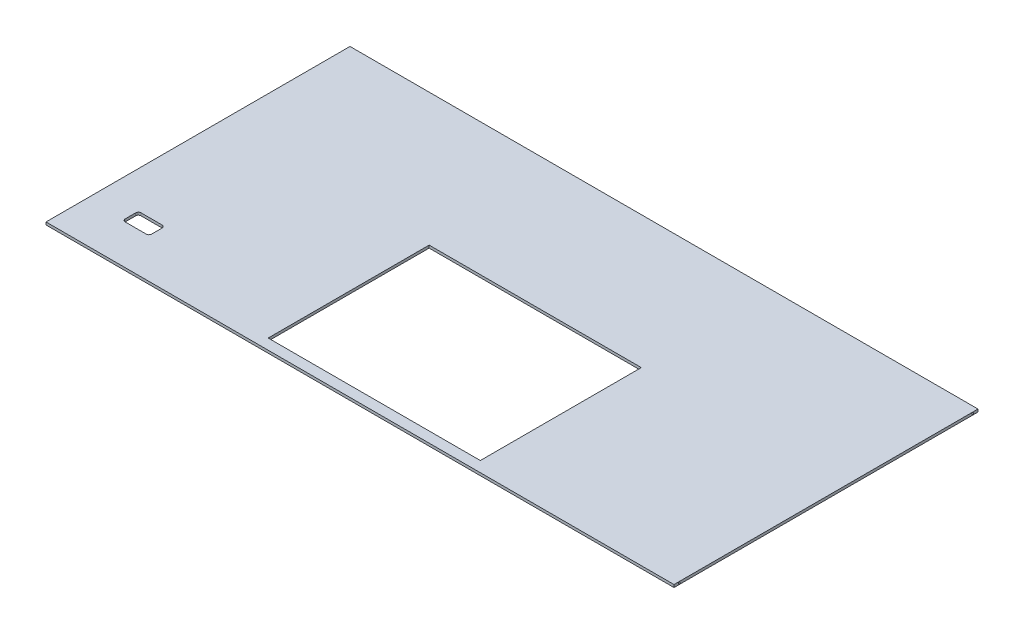
ISO-10303-21;
HEADER;
FILE_DESCRIPTION(('STEP AP214'),'2;1');
FILE_NAME('part.step','',(''),(''),'','','');
FILE_SCHEMA(('AUTOMOTIVE_DESIGN { 1 0 10303 214 1 1 1 1 }'));
ENDSEC;
DATA;
#1=APPLICATION_CONTEXT('core data for automotive mechanical design processes');
#2=APPLICATION_PROTOCOL_DEFINITION('international standard','automotive_design',2000,#1);
#3=PRODUCT_CONTEXT('',#1,'mechanical');
#4=PRODUCT('Part','Part','',(#3));
#5=PRODUCT_RELATED_PRODUCT_CATEGORY('part','',(#4));
#6=PRODUCT_DEFINITION_FORMATION('','',#4);
#7=PRODUCT_DEFINITION_CONTEXT('part definition',#1,'design');
#8=PRODUCT_DEFINITION('design','',#6,#7);
#9=PRODUCT_DEFINITION_SHAPE('','',#8);
#10=(LENGTH_UNIT() NAMED_UNIT(*) SI_UNIT(.MILLI.,.METRE.));
#11=(NAMED_UNIT(*) PLANE_ANGLE_UNIT() SI_UNIT($,.RADIAN.));
#12=(NAMED_UNIT(*) SI_UNIT($,.STERADIAN.) SOLID_ANGLE_UNIT());
#13=UNCERTAINTY_MEASURE_WITH_UNIT(LENGTH_MEASURE(1.E-05),#10,'distance_accuracy_value','');
#14=(GEOMETRIC_REPRESENTATION_CONTEXT(3) GLOBAL_UNCERTAINTY_ASSIGNED_CONTEXT((#13)) GLOBAL_UNIT_ASSIGNED_CONTEXT((#10,
#11,#12)) REPRESENTATION_CONTEXT('',''));
#15=CARTESIAN_POINT('',(0.,0.,0.));
#16=DIRECTION('',(0.,0.,1.));
#17=DIRECTION('',(1.,0.,0.));
#18=AXIS2_PLACEMENT_3D('',#15,#16,#17);
#19=CARTESIAN_POINT('',(-595.,4.99999999999989,288.));
#20=DIRECTION('',(1.,0.,0.));
#21=DIRECTION('',(0.,0.,-1.));
#22=AXIS2_PLACEMENT_3D('',#19,#20,#21);
#23=PLANE('',#22);
#24=CARTESIAN_POINT('',(-595.,2.49999999999995,278.));
#25=DIRECTION('',(1.,0.,0.));
#26=DIRECTION('',(0.,0.,-1.));
#27=AXIS2_PLACEMENT_3D('',#24,#25,#26);
#28=CIRCLE('',#27,1.50000000000002);
#29=CARTESIAN_POINT('',(-595.,2.49999999999995,276.5));
#30=VERTEX_POINT('',#29);
#31=EDGE_CURVE('E233',#30,#30,#28,.T.);
#32=ORIENTED_EDGE('',*,*,#31,.T.);
#33=EDGE_LOOP('',(#32));
#34=FACE_BOUND('',#33,.T.);
#35=CARTESIAN_POINT('',(-595.,2.49999999999995,-278.));
#36=DIRECTION('',(1.,0.,0.));
#37=DIRECTION('',(0.,0.,1.));
#38=AXIS2_PLACEMENT_3D('',#35,#36,#37);
#39=CIRCLE('',#38,1.49999999999633);
#40=CARTESIAN_POINT('',(-595.,2.49999999999995,-276.500000000003));
#41=VERTEX_POINT('',#40);
#42=EDGE_CURVE('E222',#41,#41,#39,.T.);
#43=ORIENTED_EDGE('',*,*,#42,.T.);
#44=EDGE_LOOP('',(#43));
#45=FACE_BOUND('',#44,.T.);
#46=DIRECTION('',(0.,0.,1.));
#47=VECTOR('',#46,1.);
#48=CARTESIAN_POINT('',(-595.,0.,288.));
#49=LINE('',#48,#47);
#50=CARTESIAN_POINT('',(-595.,0.,-288.));
#51=VERTEX_POINT('',#50);
#52=CARTESIAN_POINT('',(-595.,0.,288.));
#53=VERTEX_POINT('',#52);
#54=EDGE_CURVE('E244',#51,#53,#49,.T.);
#55=ORIENTED_EDGE('',*,*,#54,.T.);
#56=DIRECTION('',(0.,-1.,0.));
#57=VECTOR('',#56,1.);
#58=CARTESIAN_POINT('',(-595.,4.99999999999989,288.));
#59=LINE('',#58,#57);
#60=CARTESIAN_POINT('',(-595.,4.99999999999989,288.));
#61=VERTEX_POINT('',#60);
#62=EDGE_CURVE('E279',#61,#53,#59,.T.);
#63=ORIENTED_EDGE('',*,*,#62,.F.);
#64=DIRECTION('',(0.,0.,1.));
#65=VECTOR('',#64,1.);
#66=CARTESIAN_POINT('',(-595.,4.99999999999989,288.));
#67=LINE('',#66,#65);
#68=CARTESIAN_POINT('',(-595.,4.99999999999989,-288.));
#69=VERTEX_POINT('',#68);
#70=EDGE_CURVE('E253',#69,#61,#67,.T.);
#71=ORIENTED_EDGE('',*,*,#70,.F.);
#72=DIRECTION('',(0.,-1.,0.));
#73=VECTOR('',#72,1.);
#74=CARTESIAN_POINT('',(-595.,4.99999999999989,-288.));
#75=LINE('',#74,#73);
#76=EDGE_CURVE('E263',#69,#51,#75,.T.);
#77=ORIENTED_EDGE('',*,*,#76,.T.);
#78=EDGE_LOOP('',(#55,#63,#71,#77));
#79=FACE_BOUND('',#78,.T.);
#80=ADVANCED_FACE('F47',(#34,#45,#79),#23,.F.);
#81=CARTESIAN_POINT('',(595.,4.99999999999989,288.));
#82=DIRECTION('',(0.,0.,-1.));
#83=DIRECTION('',(-1.,0.,0.));
#84=AXIS2_PLACEMENT_3D('',#81,#82,#83);
#85=PLANE('',#84);
#86=DIRECTION('',(1.,0.,0.));
#87=VECTOR('',#86,1.);
#88=CARTESIAN_POINT('',(595.,0.,288.));
#89=LINE('',#88,#87);
#90=CARTESIAN_POINT('',(595.,0.,288.));
#91=VERTEX_POINT('',#90);
#92=EDGE_CURVE('E266',#53,#91,#89,.T.);
#93=ORIENTED_EDGE('',*,*,#92,.T.);
#94=DIRECTION('',(0.,-1.,0.));
#95=VECTOR('',#94,1.);
#96=CARTESIAN_POINT('',(595.,4.99999999999989,288.));
#97=LINE('',#96,#95);
#98=CARTESIAN_POINT('',(595.,4.99999999999989,288.));
#99=VERTEX_POINT('',#98);
#100=EDGE_CURVE('E276',#99,#91,#97,.T.);
#101=ORIENTED_EDGE('',*,*,#100,.F.);
#102=DIRECTION('',(1.,0.,0.));
#103=VECTOR('',#102,1.);
#104=CARTESIAN_POINT('',(595.,4.99999999999989,288.));
#105=LINE('',#104,#103);
#106=EDGE_CURVE('E256',#61,#99,#105,.T.);
#107=ORIENTED_EDGE('',*,*,#106,.F.);
#108=ORIENTED_EDGE('',*,*,#62,.T.);
#109=EDGE_LOOP('',(#93,#101,#107,#108));
#110=FACE_BOUND('',#109,.T.);
#111=ADVANCED_FACE('F346',(#110),#85,.F.);
#112=CARTESIAN_POINT('',(595.,4.99999999999989,288.));
#113=DIRECTION('',(-1.,0.,0.));
#114=DIRECTION('',(0.,0.,1.));
#115=AXIS2_PLACEMENT_3D('',#112,#113,#114);
#116=PLANE('',#115);
#117=CARTESIAN_POINT('',(595.,2.49999999999995,278.));
#118=DIRECTION('',(1.,0.,0.));
#119=DIRECTION('',(0.,0.,-1.));
#120=AXIS2_PLACEMENT_3D('',#117,#118,#119);
#121=CIRCLE('',#120,1.50000000000002);
#122=CARTESIAN_POINT('',(595.,2.49999999999995,276.5));
#123=VERTEX_POINT('',#122);
#124=EDGE_CURVE('E245',#123,#123,#121,.T.);
#125=ORIENTED_EDGE('',*,*,#124,.F.);
#126=EDGE_LOOP('',(#125));
#127=FACE_BOUND('',#126,.T.);
#128=CARTESIAN_POINT('',(595.,2.49999999999995,-278.));
#129=DIRECTION('',(1.,0.,0.));
#130=DIRECTION('',(0.,0.,1.));
#131=AXIS2_PLACEMENT_3D('',#128,#129,#130);
#132=CIRCLE('',#131,1.49999999999633);
#133=CARTESIAN_POINT('',(595.,2.49999999999995,-276.500000000003));
#134=VERTEX_POINT('',#133);
#135=EDGE_CURVE('E248',#134,#134,#132,.T.);
#136=ORIENTED_EDGE('',*,*,#135,.F.);
#137=EDGE_LOOP('',(#136));
#138=FACE_BOUND('',#137,.T.);
#139=DIRECTION('',(0.,0.,-1.));
#140=VECTOR('',#139,1.);
#141=CARTESIAN_POINT('',(595.,0.,288.));
#142=LINE('',#141,#140);
#143=CARTESIAN_POINT('',(595.,0.,-288.));
#144=VERTEX_POINT('',#143);
#145=EDGE_CURVE('E268',#91,#144,#142,.T.);
#146=ORIENTED_EDGE('',*,*,#145,.T.);
#147=DIRECTION('',(0.,-1.,0.));
#148=VECTOR('',#147,1.);
#149=CARTESIAN_POINT('',(595.,4.99999999999989,-288.));
#150=LINE('',#149,#148);
#151=CARTESIAN_POINT('',(595.,4.99999999999989,-288.));
#152=VERTEX_POINT('',#151);
#153=EDGE_CURVE('E273',#152,#144,#150,.T.);
#154=ORIENTED_EDGE('',*,*,#153,.F.);
#155=DIRECTION('',(0.,0.,-1.));
#156=VECTOR('',#155,1.);
#157=CARTESIAN_POINT('',(595.,4.99999999999989,288.));
#158=LINE('',#157,#156);
#159=EDGE_CURVE('E259',#99,#152,#158,.T.);
#160=ORIENTED_EDGE('',*,*,#159,.F.);
#161=ORIENTED_EDGE('',*,*,#100,.T.);
#162=EDGE_LOOP('',(#146,#154,#160,#161));
#163=FACE_BOUND('',#162,.T.);
#164=ADVANCED_FACE('F352',(#127,#138,#163),#116,.F.);
#165=CARTESIAN_POINT('',(595.,4.99999999999989,-288.));
#166=DIRECTION('',(0.,0.,1.));
#167=DIRECTION('',(1.,0.,0.));
#168=AXIS2_PLACEMENT_3D('',#165,#166,#167);
#169=PLANE('',#168);
#170=DIRECTION('',(-1.,0.,0.));
#171=VECTOR('',#170,1.);
#172=CARTESIAN_POINT('',(595.,0.,-288.));
#173=LINE('',#172,#171);
#174=EDGE_CURVE('E257',#144,#51,#173,.T.);
#175=ORIENTED_EDGE('',*,*,#174,.T.);
#176=ORIENTED_EDGE('',*,*,#76,.F.);
#177=DIRECTION('',(-1.,0.,0.));
#178=VECTOR('',#177,1.);
#179=CARTESIAN_POINT('',(595.,4.99999999999989,-288.));
#180=LINE('',#179,#178);
#181=EDGE_CURVE('E261',#152,#69,#180,.T.);
#182=ORIENTED_EDGE('',*,*,#181,.F.);
#183=ORIENTED_EDGE('',*,*,#153,.T.);
#184=EDGE_LOOP('',(#175,#176,#182,#183));
#185=FACE_BOUND('',#184,.T.);
#186=ADVANCED_FACE('F371',(#185),#169,.F.);
#187=CARTESIAN_POINT('',(0.,4.99999999999989,0.));
#188=DIRECTION('',(0.,1.,0.));
#189=DIRECTION('',(0.,0.,1.));
#190=AXIS2_PLACEMENT_3D('',#187,#188,#189);
#191=PLANE('',#190);
#192=CARTESIAN_POINT('',(-520.000000000028,4.99999999999989,187.99999999998));
#193=DIRECTION('',(0.,1.,0.));
#194=DIRECTION('',(0.,0.,-1.));
#195=AXIS2_PLACEMENT_3D('',#192,#193,#194);
#196=CIRCLE('',#195,4.99999999999921);
#197=CARTESIAN_POINT('',(-520.000000000028,4.99999999999989,182.999999999981));
#198=VERTEX_POINT('',#197);
#199=CARTESIAN_POINT('',(-525.000000000027,4.99999999999989,187.99999999998));
#200=VERTEX_POINT('',#199);
#201=EDGE_CURVE('E61',#198,#200,#196,.T.);
#202=ORIENTED_EDGE('',*,*,#201,.F.);
#203=DIRECTION('',(-1.,0.,0.));
#204=VECTOR('',#203,1.);
#205=CARTESIAN_POINT('',(-520.000000000028,4.99999999999989,182.999999999981));
#206=LINE('',#205,#204);
#207=CARTESIAN_POINT('',(-480.000000000026,4.99999999999989,182.999999999981));
#208=VERTEX_POINT('',#207);
#209=EDGE_CURVE('E193',#208,#198,#206,.T.);
#210=ORIENTED_EDGE('',*,*,#209,.F.);
#211=CARTESIAN_POINT('',(-480.000000000026,4.99999999999989,187.99999999998));
#212=DIRECTION('',(0.,1.,0.));
#213=DIRECTION('',(0.,0.,-1.));
#214=AXIS2_PLACEMENT_3D('',#211,#212,#213);
#215=CIRCLE('',#214,4.99999999999917);
#216=CARTESIAN_POINT('',(-475.000000000027,4.99999999999989,187.999999999981));
#217=VERTEX_POINT('',#216);
#218=EDGE_CURVE('E190',#217,#208,#215,.T.);
#219=ORIENTED_EDGE('',*,*,#218,.F.);
#220=DIRECTION('',(0.,0.,-1.));
#221=VECTOR('',#220,1.);
#222=CARTESIAN_POINT('',(-475.000000000027,4.99999999999989,187.999999999981));
#223=LINE('',#222,#221);
#224=CARTESIAN_POINT('',(-475.000000000027,4.99999999999989,207.999999999981));
#225=VERTEX_POINT('',#224);
#226=EDGE_CURVE('E187',#225,#217,#223,.T.);
#227=ORIENTED_EDGE('',*,*,#226,.F.);
#228=CARTESIAN_POINT('',(-480.000000000027,4.99999999999989,207.999999999981));
#229=DIRECTION('',(0.,1.,0.));
#230=DIRECTION('',(0.,0.,-1.));
#231=AXIS2_PLACEMENT_3D('',#228,#229,#230);
#232=CIRCLE('',#231,5.);
#233=CARTESIAN_POINT('',(-480.000000000027,4.99999999999989,212.999999999981));
#234=VERTEX_POINT('',#233);
#235=EDGE_CURVE('E181',#234,#225,#232,.T.);
#236=ORIENTED_EDGE('',*,*,#235,.F.);
#237=DIRECTION('',(1.,0.,0.));
#238=VECTOR('',#237,1.);
#239=CARTESIAN_POINT('',(-480.000000000027,4.99999999999989,212.999999999981));
#240=LINE('',#239,#238);
#241=CARTESIAN_POINT('',(-520.000000000027,4.99999999999989,212.999999999981));
#242=VERTEX_POINT('',#241);
#243=EDGE_CURVE('E179',#242,#234,#240,.T.);
#244=ORIENTED_EDGE('',*,*,#243,.F.);
#245=CARTESIAN_POINT('',(-520.000000000027,4.99999999999989,207.999999999981));
#246=DIRECTION('',(0.,1.,0.));
#247=DIRECTION('',(0.,0.,-1.));
#248=AXIS2_PLACEMENT_3D('',#245,#246,#247);
#249=CIRCLE('',#248,4.99999999999992);
#250=CARTESIAN_POINT('',(-525.000000000027,4.99999999999989,207.999999999981));
#251=VERTEX_POINT('',#250);
#252=EDGE_CURVE('E162',#251,#242,#249,.T.);
#253=ORIENTED_EDGE('',*,*,#252,.F.);
#254=DIRECTION('',(0.,0.,1.));
#255=VECTOR('',#254,1.);
#256=CARTESIAN_POINT('',(-525.000000000027,4.99999999999989,207.999999999981));
#257=LINE('',#256,#255);
#258=EDGE_CURVE('E171',#200,#251,#257,.T.);
#259=ORIENTED_EDGE('',*,*,#258,.F.);
#260=EDGE_LOOP('',(#202,#210,#219,#227,#236,#244,#253,#259));
#261=FACE_BOUND('',#260,.T.);
#262=DIRECTION('',(0.,0.,1.));
#263=VECTOR('',#262,1.);
#264=CARTESIAN_POINT('',(-194.,4.99999999999989,-36.9999999999999));
#265=LINE('',#264,#263);
#266=CARTESIAN_POINT('',(-194.,4.99999999999989,-36.9999999999999));
#267=VERTEX_POINT('',#266);
#268=CARTESIAN_POINT('',(-194.,4.99999999999989,268.));
#269=VERTEX_POINT('',#268);
#270=EDGE_CURVE('E198',#267,#269,#265,.T.);
#271=ORIENTED_EDGE('',*,*,#270,.F.);
#272=DIRECTION('',(-1.,0.,0.));
#273=VECTOR('',#272,1.);
#274=CARTESIAN_POINT('',(-194.,4.99999999999989,-36.9999999999999));
#275=LINE('',#274,#273);
#276=CARTESIAN_POINT('',(208.,4.99999999999989,-36.9999999999999));
#277=VERTEX_POINT('',#276);
#278=EDGE_CURVE('E216',#277,#267,#275,.T.);
#279=ORIENTED_EDGE('',*,*,#278,.F.);
#280=DIRECTION('',(0.,0.,-1.));
#281=VECTOR('',#280,1.);
#282=CARTESIAN_POINT('',(208.,4.99999999999989,-36.9999999999999));
#283=LINE('',#282,#281);
#284=CARTESIAN_POINT('',(208.,4.99999999999989,268.));
#285=VERTEX_POINT('',#284);
#286=EDGE_CURVE('E213',#285,#277,#283,.T.);
#287=ORIENTED_EDGE('',*,*,#286,.F.);
#288=DIRECTION('',(1.,0.,0.));
#289=VECTOR('',#288,1.);
#290=CARTESIAN_POINT('',(-194.,4.99999999999989,268.));
#291=LINE('',#290,#289);
#292=EDGE_CURVE('E210',#269,#285,#291,.T.);
#293=ORIENTED_EDGE('',*,*,#292,.F.);
#294=EDGE_LOOP('',(#271,#279,#287,#293));
#295=FACE_BOUND('',#294,.T.);
#296=ORIENTED_EDGE('',*,*,#70,.T.);
#297=ORIENTED_EDGE('',*,*,#106,.T.);
#298=ORIENTED_EDGE('',*,*,#159,.T.);
#299=ORIENTED_EDGE('',*,*,#181,.T.);
#300=EDGE_LOOP('',(#296,#297,#298,#299));
#301=FACE_BOUND('',#300,.T.);
#302=ADVANCED_FACE('F175',(#261,#295,#301),#191,.T.);
#303=CARTESIAN_POINT('',(0.,0.,0.));
#304=DIRECTION('',(0.,1.,0.));
#305=DIRECTION('',(0.,0.,1.));
#306=AXIS2_PLACEMENT_3D('',#303,#304,#305);
#307=PLANE('',#306);
#308=DIRECTION('',(-1.,0.,0.));
#309=VECTOR('',#308,1.);
#310=CARTESIAN_POINT('',(-2.03309591384482E-12,0.,182.999999999987));
#311=LINE('',#310,#309);
#312=CARTESIAN_POINT('',(-480.000000000026,0.,182.999999999981));
#313=VERTEX_POINT('',#312);
#314=CARTESIAN_POINT('',(-520.000000000028,0.,182.999999999981));
#315=VERTEX_POINT('',#314);
#316=EDGE_CURVE('E54',#313,#315,#311,.T.);
#317=ORIENTED_EDGE('',*,*,#316,.T.);
#318=CARTESIAN_POINT('',(-520.000000000028,0.,187.99999999998));
#319=DIRECTION('',(0.,1.,0.));
#320=DIRECTION('',(0.,0.,1.));
#321=AXIS2_PLACEMENT_3D('',#318,#319,#320);
#322=CIRCLE('',#321,4.99999999999921);
#323=CARTESIAN_POINT('',(-525.000000000027,0.,187.99999999998));
#324=VERTEX_POINT('',#323);
#325=EDGE_CURVE('E11',#315,#324,#322,.T.);
#326=ORIENTED_EDGE('',*,*,#325,.T.);
#327=DIRECTION('',(0.,0.,1.));
#328=VECTOR('',#327,1.);
#329=CARTESIAN_POINT('',(-525.000000000025,0.,-5.77315972805081E-12));
#330=LINE('',#329,#328);
#331=CARTESIAN_POINT('',(-525.000000000027,0.,207.999999999981));
#332=VERTEX_POINT('',#331);
#333=EDGE_CURVE('E294',#324,#332,#330,.T.);
#334=ORIENTED_EDGE('',*,*,#333,.T.);
#335=CARTESIAN_POINT('',(-520.000000000027,0.,207.999999999981));
#336=DIRECTION('',(0.,1.,0.));
#337=DIRECTION('',(0.,0.,1.));
#338=AXIS2_PLACEMENT_3D('',#335,#336,#337);
#339=CIRCLE('',#338,4.99999999999992);
#340=CARTESIAN_POINT('',(-520.000000000027,0.,212.999999999981));
#341=VERTEX_POINT('',#340);
#342=EDGE_CURVE('E165',#332,#341,#339,.T.);
#343=ORIENTED_EDGE('',*,*,#342,.T.);
#344=DIRECTION('',(1.,0.,0.));
#345=VECTOR('',#344,1.);
#346=CARTESIAN_POINT('',(-2.21350715534641E-12,0.,212.999999999986));
#347=LINE('',#346,#345);
#348=CARTESIAN_POINT('',(-480.000000000027,0.,212.999999999981));
#349=VERTEX_POINT('',#348);
#350=EDGE_CURVE('E297',#341,#349,#347,.T.);
#351=ORIENTED_EDGE('',*,*,#350,.T.);
#352=CARTESIAN_POINT('',(-480.000000000027,0.,207.999999999981));
#353=DIRECTION('',(0.,1.,0.));
#354=DIRECTION('',(0.,0.,1.));
#355=AXIS2_PLACEMENT_3D('',#352,#353,#354);
#356=CIRCLE('',#355,5.);
#357=CARTESIAN_POINT('',(-475.000000000027,0.,207.999999999981));
#358=VERTEX_POINT('',#357);
#359=EDGE_CURVE('E300',#349,#358,#356,.T.);
#360=ORIENTED_EDGE('',*,*,#359,.T.);
#361=DIRECTION('',(0.,0.,-1.));
#362=VECTOR('',#361,1.);
#363=CARTESIAN_POINT('',(-475.000000000025,0.,-5.32907051820075E-12));
#364=LINE('',#363,#362);
#365=CARTESIAN_POINT('',(-475.000000000027,0.,187.999999999981));
#366=VERTEX_POINT('',#365);
#367=EDGE_CURVE('E303',#358,#366,#364,.T.);
#368=ORIENTED_EDGE('',*,*,#367,.T.);
#369=CARTESIAN_POINT('',(-480.000000000026,0.,187.99999999998));
#370=DIRECTION('',(0.,1.,0.));
#371=DIRECTION('',(0.,0.,1.));
#372=AXIS2_PLACEMENT_3D('',#369,#370,#371);
#373=CIRCLE('',#372,4.99999999999917);
#374=EDGE_CURVE('E306',#366,#313,#373,.T.);
#375=ORIENTED_EDGE('',*,*,#374,.T.);
#376=EDGE_LOOP('',(#317,#326,#334,#343,#351,#360,#368,#375));
#377=FACE_BOUND('',#376,.T.);
#378=DIRECTION('',(-1.,0.,0.));
#379=VECTOR('',#378,1.);
#380=CARTESIAN_POINT('',(0.,0.,-36.9999999999999));
#381=LINE('',#380,#379);
#382=CARTESIAN_POINT('',(208.,0.,-36.9999999999999));
#383=VERTEX_POINT('',#382);
#384=CARTESIAN_POINT('',(-194.,0.,-36.9999999999999));
#385=VERTEX_POINT('',#384);
#386=EDGE_CURVE('E288',#383,#385,#381,.T.);
#387=ORIENTED_EDGE('',*,*,#386,.T.);
#388=DIRECTION('',(0.,0.,1.));
#389=VECTOR('',#388,1.);
#390=CARTESIAN_POINT('',(-194.,0.,0.));
#391=LINE('',#390,#389);
#392=CARTESIAN_POINT('',(-194.,0.,268.));
#393=VERTEX_POINT('',#392);
#394=EDGE_CURVE('E291',#385,#393,#391,.T.);
#395=ORIENTED_EDGE('',*,*,#394,.T.);
#396=DIRECTION('',(1.,0.,0.));
#397=VECTOR('',#396,1.);
#398=CARTESIAN_POINT('',(0.,0.,268.));
#399=LINE('',#398,#397);
#400=CARTESIAN_POINT('',(208.,0.,268.));
#401=VERTEX_POINT('',#400);
#402=EDGE_CURVE('E282',#393,#401,#399,.T.);
#403=ORIENTED_EDGE('',*,*,#402,.T.);
#404=DIRECTION('',(0.,0.,-1.));
#405=VECTOR('',#404,1.);
#406=CARTESIAN_POINT('',(208.,0.,0.));
#407=LINE('',#406,#405);
#408=EDGE_CURVE('E285',#401,#383,#407,.T.);
#409=ORIENTED_EDGE('',*,*,#408,.T.);
#410=EDGE_LOOP('',(#387,#395,#403,#409));
#411=FACE_BOUND('',#410,.T.);
#412=ORIENTED_EDGE('',*,*,#54,.F.);
#413=ORIENTED_EDGE('',*,*,#174,.F.);
#414=ORIENTED_EDGE('',*,*,#145,.F.);
#415=ORIENTED_EDGE('',*,*,#92,.F.);
#416=EDGE_LOOP('',(#412,#413,#414,#415));
#417=FACE_BOUND('',#416,.T.);
#418=ADVANCED_FACE('F310',(#377,#411,#417),#307,.F.);
#419=CARTESIAN_POINT('',(585.,2.49999999999995,-278.));
#420=DIRECTION('',(1.,0.,0.));
#421=DIRECTION('',(0.,0.,-1.));
#422=AXIS2_PLACEMENT_3D('',#419,#420,#421);
#423=CYLINDRICAL_SURFACE('',#422,1.49999999999633);
#424=CARTESIAN_POINT('',(585.,2.49999999999995,-278.));
#425=DIRECTION('',(1.,0.,0.));
#426=DIRECTION('',(0.,0.,1.));
#427=AXIS2_PLACEMENT_3D('',#424,#425,#426);
#428=CIRCLE('',#427,1.49999999999633);
#429=CARTESIAN_POINT('',(585.,2.49999999999995,-276.500000000003));
#430=VERTEX_POINT('',#429);
#431=EDGE_CURVE('E232',#430,#430,#428,.T.);
#432=ORIENTED_EDGE('',*,*,#431,.F.);
#433=EDGE_LOOP('',(#432));
#434=FACE_BOUND('',#433,.T.);
#435=ORIENTED_EDGE('',*,*,#135,.T.);
#436=EDGE_LOOP('',(#435));
#437=FACE_BOUND('',#436,.T.);
#438=ADVANCED_FACE('F386',(#434,#437),#423,.F.);
#439=CARTESIAN_POINT('',(585.,2.49999999999995,-278.));
#440=DIRECTION('',(-1.,0.,0.));
#441=DIRECTION('',(0.,0.,1.));
#442=AXIS2_PLACEMENT_3D('',#439,#440,#441);
#443=PLANE('',#442);
#444=ORIENTED_EDGE('',*,*,#431,.T.);
#445=EDGE_LOOP('',(#444));
#446=FACE_BOUND('',#445,.T.);
#447=ADVANCED_FACE('F389',(#446),#443,.F.);
#448=CARTESIAN_POINT('',(585.,2.49999999999995,278.));
#449=DIRECTION('',(1.,0.,0.));
#450=DIRECTION('',(0.,0.,-1.));
#451=AXIS2_PLACEMENT_3D('',#448,#449,#450);
#452=CYLINDRICAL_SURFACE('',#451,1.50000000000002);
#453=CARTESIAN_POINT('',(585.,2.49999999999995,278.));
#454=DIRECTION('',(1.,0.,0.));
#455=DIRECTION('',(0.,0.,-1.));
#456=AXIS2_PLACEMENT_3D('',#453,#454,#455);
#457=CIRCLE('',#456,1.50000000000002);
#458=CARTESIAN_POINT('',(585.,2.49999999999995,276.5));
#459=VERTEX_POINT('',#458);
#460=EDGE_CURVE('E241',#459,#459,#457,.T.);
#461=ORIENTED_EDGE('',*,*,#460,.F.);
#462=EDGE_LOOP('',(#461));
#463=FACE_BOUND('',#462,.T.);
#464=ORIENTED_EDGE('',*,*,#124,.T.);
#465=EDGE_LOOP('',(#464));
#466=FACE_BOUND('',#465,.T.);
#467=ADVANCED_FACE('F392',(#463,#466),#452,.F.);
#468=CARTESIAN_POINT('',(585.,2.49999999999995,278.));
#469=DIRECTION('',(1.,0.,0.));
#470=DIRECTION('',(0.,0.,-1.));
#471=AXIS2_PLACEMENT_3D('',#468,#469,#470);
#472=PLANE('',#471);
#473=ORIENTED_EDGE('',*,*,#460,.T.);
#474=EDGE_LOOP('',(#473));
#475=FACE_BOUND('',#474,.T.);
#476=ADVANCED_FACE('F399',(#475),#472,.T.);
#477=CARTESIAN_POINT('',(-585.,2.49999999999995,-278.));
#478=DIRECTION('',(-1.,0.,0.));
#479=DIRECTION('',(0.,0.,1.));
#480=AXIS2_PLACEMENT_3D('',#477,#478,#479);
#481=CYLINDRICAL_SURFACE('',#480,1.49999999999633);
#482=CARTESIAN_POINT('',(-585.,2.49999999999995,-278.));
#483=DIRECTION('',(1.,0.,0.));
#484=DIRECTION('',(0.,0.,1.));
#485=AXIS2_PLACEMENT_3D('',#482,#483,#484);
#486=CIRCLE('',#485,1.49999999999633);
#487=CARTESIAN_POINT('',(-585.,2.49999999999995,-276.500000000003));
#488=VERTEX_POINT('',#487);
#489=EDGE_CURVE('E236',#488,#488,#486,.T.);
#490=ORIENTED_EDGE('',*,*,#489,.T.);
#491=EDGE_LOOP('',(#490));
#492=FACE_BOUND('',#491,.T.);
#493=ORIENTED_EDGE('',*,*,#42,.F.);
#494=EDGE_LOOP('',(#493));
#495=FACE_BOUND('',#494,.T.);
#496=ADVANCED_FACE('F403',(#492,#495),#481,.F.);
#497=CARTESIAN_POINT('',(-585.,2.49999999999995,-278.));
#498=DIRECTION('',(1.,0.,0.));
#499=DIRECTION('',(0.,0.,1.));
#500=AXIS2_PLACEMENT_3D('',#497,#498,#499);
#501=PLANE('',#500);
#502=ORIENTED_EDGE('',*,*,#489,.F.);
#503=EDGE_LOOP('',(#502));
#504=FACE_BOUND('',#503,.T.);
#505=ADVANCED_FACE('F407',(#504),#501,.F.);
#506=CARTESIAN_POINT('',(-585.,2.49999999999995,278.));
#507=DIRECTION('',(-1.,0.,0.));
#508=DIRECTION('',(0.,0.,1.));
#509=AXIS2_PLACEMENT_3D('',#506,#507,#508);
#510=CYLINDRICAL_SURFACE('',#509,1.50000000000002);
#511=CARTESIAN_POINT('',(-585.,2.49999999999995,278.));
#512=DIRECTION('',(1.,0.,0.));
#513=DIRECTION('',(0.,0.,-1.));
#514=AXIS2_PLACEMENT_3D('',#511,#512,#513);
#515=CIRCLE('',#514,1.50000000000002);
#516=CARTESIAN_POINT('',(-585.,2.49999999999995,276.5));
#517=VERTEX_POINT('',#516);
#518=EDGE_CURVE('E229',#517,#517,#515,.T.);
#519=ORIENTED_EDGE('',*,*,#518,.T.);
#520=EDGE_LOOP('',(#519));
#521=FACE_BOUND('',#520,.T.);
#522=ORIENTED_EDGE('',*,*,#31,.F.);
#523=EDGE_LOOP('',(#522));
#524=FACE_BOUND('',#523,.T.);
#525=ADVANCED_FACE('F411',(#521,#524),#510,.F.);
#526=CARTESIAN_POINT('',(-585.,2.49999999999995,278.));
#527=DIRECTION('',(-1.,0.,0.));
#528=DIRECTION('',(0.,0.,-1.));
#529=AXIS2_PLACEMENT_3D('',#526,#527,#528);
#530=PLANE('',#529);
#531=ORIENTED_EDGE('',*,*,#518,.F.);
#532=EDGE_LOOP('',(#531));
#533=FACE_BOUND('',#532,.T.);
#534=ADVANCED_FACE('F415',(#533),#530,.T.);
#535=CARTESIAN_POINT('',(-194.,-0.99999999999989,-36.9999999999999));
#536=DIRECTION('',(-1.,0.,0.));
#537=DIRECTION('',(0.,0.,1.));
#538=AXIS2_PLACEMENT_3D('',#535,#536,#537);
#539=PLANE('',#538);
#540=DIRECTION('',(0.,1.,0.));
#541=VECTOR('',#540,1.);
#542=CARTESIAN_POINT('',(-194.,-0.99999999999989,-36.9999999999999));
#543=LINE('',#542,#541);
#544=EDGE_CURVE('E220',#385,#267,#543,.T.);
#545=ORIENTED_EDGE('',*,*,#544,.T.);
#546=ORIENTED_EDGE('',*,*,#270,.T.);
#547=DIRECTION('',(0.,1.,0.));
#548=VECTOR('',#547,1.);
#549=CARTESIAN_POINT('',(-194.,-0.99999999999989,268.));
#550=LINE('',#549,#548);
#551=EDGE_CURVE('E219',#393,#269,#550,.T.);
#552=ORIENTED_EDGE('',*,*,#551,.F.);
#553=ORIENTED_EDGE('',*,*,#394,.F.);
#554=EDGE_LOOP('',(#545,#546,#552,#553));
#555=FACE_BOUND('',#554,.T.);
#556=ADVANCED_FACE('F419',(#555),#539,.F.);
#557=CARTESIAN_POINT('',(-194.,-0.99999999999989,-36.9999999999999));
#558=DIRECTION('',(0.,0.,-1.));
#559=DIRECTION('',(-1.,0.,0.));
#560=AXIS2_PLACEMENT_3D('',#557,#558,#559);
#561=PLANE('',#560);
#562=DIRECTION('',(0.,1.,0.));
#563=VECTOR('',#562,1.);
#564=CARTESIAN_POINT('',(208.,-0.99999999999989,-36.9999999999999));
#565=LINE('',#564,#563);
#566=EDGE_CURVE('E223',#383,#277,#565,.T.);
#567=ORIENTED_EDGE('',*,*,#566,.T.);
#568=ORIENTED_EDGE('',*,*,#278,.T.);
#569=ORIENTED_EDGE('',*,*,#544,.F.);
#570=ORIENTED_EDGE('',*,*,#386,.F.);
#571=EDGE_LOOP('',(#567,#568,#569,#570));
#572=FACE_BOUND('',#571,.T.);
#573=ADVANCED_FACE('F422',(#572),#561,.F.);
#574=CARTESIAN_POINT('',(208.,-0.99999999999989,-36.9999999999999));
#575=DIRECTION('',(1.,0.,0.));
#576=DIRECTION('',(0.,0.,-1.));
#577=AXIS2_PLACEMENT_3D('',#574,#575,#576);
#578=PLANE('',#577);
#579=DIRECTION('',(0.,1.,0.));
#580=VECTOR('',#579,1.);
#581=CARTESIAN_POINT('',(208.,-0.99999999999989,268.));
#582=LINE('',#581,#580);
#583=EDGE_CURVE('E225',#401,#285,#582,.T.);
#584=ORIENTED_EDGE('',*,*,#583,.T.);
#585=ORIENTED_EDGE('',*,*,#286,.T.);
#586=ORIENTED_EDGE('',*,*,#566,.F.);
#587=ORIENTED_EDGE('',*,*,#408,.F.);
#588=EDGE_LOOP('',(#584,#585,#586,#587));
#589=FACE_BOUND('',#588,.T.);
#590=ADVANCED_FACE('F340',(#589),#578,.F.);
#591=CARTESIAN_POINT('',(-194.,-0.99999999999989,268.));
#592=DIRECTION('',(0.,0.,1.));
#593=DIRECTION('',(1.,0.,0.));
#594=AXIS2_PLACEMENT_3D('',#591,#592,#593);
#595=PLANE('',#594);
#596=ORIENTED_EDGE('',*,*,#551,.T.);
#597=ORIENTED_EDGE('',*,*,#292,.T.);
#598=ORIENTED_EDGE('',*,*,#583,.F.);
#599=ORIENTED_EDGE('',*,*,#402,.F.);
#600=EDGE_LOOP('',(#596,#597,#598,#599));
#601=FACE_BOUND('',#600,.T.);
#602=ADVANCED_FACE('F332',(#601),#595,.F.);
#603=CARTESIAN_POINT('',(-520.000000000028,-4.99999999999989,187.99999999998));
#604=DIRECTION('',(0.,1.,0.));
#605=DIRECTION('',(0.,0.,1.));
#606=AXIS2_PLACEMENT_3D('',#603,#604,#605);
#607=CYLINDRICAL_SURFACE('',#606,4.99999999999921);
#608=DIRECTION('',(0.,1.,0.));
#609=VECTOR('',#608,1.);
#610=CARTESIAN_POINT('',(-520.000000000028,-4.99999999999989,182.999999999981));
#611=LINE('',#610,#609);
#612=EDGE_CURVE('E196',#315,#198,#611,.T.);
#613=ORIENTED_EDGE('',*,*,#612,.T.);
#614=ORIENTED_EDGE('',*,*,#201,.T.);
#615=DIRECTION('',(0.,1.,0.));
#616=VECTOR('',#615,1.);
#617=CARTESIAN_POINT('',(-525.000000000027,-4.99999999999989,187.99999999998));
#618=LINE('',#617,#616);
#619=EDGE_CURVE('E168',#324,#200,#618,.T.);
#620=ORIENTED_EDGE('',*,*,#619,.F.);
#621=ORIENTED_EDGE('',*,*,#325,.F.);
#622=EDGE_LOOP('',(#613,#614,#620,#621));
#623=FACE_BOUND('',#622,.T.);
#624=ADVANCED_FACE('F330',(#623),#607,.F.);
#625=CARTESIAN_POINT('',(-520.000000000028,-4.99999999999989,182.999999999981));
#626=DIRECTION('',(0.,0.,-1.));
#627=DIRECTION('',(-1.,0.,0.));
#628=AXIS2_PLACEMENT_3D('',#625,#626,#627);
#629=PLANE('',#628);
#630=DIRECTION('',(0.,1.,0.));
#631=VECTOR('',#630,1.);
#632=CARTESIAN_POINT('',(-480.000000000026,-4.99999999999989,182.999999999981));
#633=LINE('',#632,#631);
#634=EDGE_CURVE('E199',#313,#208,#633,.T.);
#635=ORIENTED_EDGE('',*,*,#634,.T.);
#636=ORIENTED_EDGE('',*,*,#209,.T.);
#637=ORIENTED_EDGE('',*,*,#612,.F.);
#638=ORIENTED_EDGE('',*,*,#316,.F.);
#639=EDGE_LOOP('',(#635,#636,#637,#638));
#640=FACE_BOUND('',#639,.T.);
#641=ADVANCED_FACE('F315',(#640),#629,.F.);
#642=CARTESIAN_POINT('',(-480.000000000026,-4.99999999999989,187.99999999998));
#643=DIRECTION('',(0.,1.,0.));
#644=DIRECTION('',(0.,0.,1.));
#645=AXIS2_PLACEMENT_3D('',#642,#643,#644);
#646=CYLINDRICAL_SURFACE('',#645,4.99999999999917);
#647=DIRECTION('',(0.,1.,0.));
#648=VECTOR('',#647,1.);
#649=CARTESIAN_POINT('',(-475.000000000027,-4.99999999999989,187.999999999981));
#650=LINE('',#649,#648);
#651=EDGE_CURVE('E201',#366,#217,#650,.T.);
#652=ORIENTED_EDGE('',*,*,#651,.T.);
#653=ORIENTED_EDGE('',*,*,#218,.T.);
#654=ORIENTED_EDGE('',*,*,#634,.F.);
#655=ORIENTED_EDGE('',*,*,#374,.F.);
#656=EDGE_LOOP('',(#652,#653,#654,#655));
#657=FACE_BOUND('',#656,.T.);
#658=ADVANCED_FACE('F317',(#657),#646,.F.);
#659=CARTESIAN_POINT('',(-475.000000000027,-4.99999999999989,187.999999999981));
#660=DIRECTION('',(1.,0.,0.));
#661=DIRECTION('',(0.,0.,-1.));
#662=AXIS2_PLACEMENT_3D('',#659,#660,#661);
#663=PLANE('',#662);
#664=DIRECTION('',(0.,1.,0.));
#665=VECTOR('',#664,1.);
#666=CARTESIAN_POINT('',(-475.000000000027,-4.99999999999989,207.999999999981));
#667=LINE('',#666,#665);
#668=EDGE_CURVE('E203',#358,#225,#667,.T.);
#669=ORIENTED_EDGE('',*,*,#668,.T.);
#670=ORIENTED_EDGE('',*,*,#226,.T.);
#671=ORIENTED_EDGE('',*,*,#651,.F.);
#672=ORIENTED_EDGE('',*,*,#367,.F.);
#673=EDGE_LOOP('',(#669,#670,#671,#672));
#674=FACE_BOUND('',#673,.T.);
#675=ADVANCED_FACE('F323',(#674),#663,.F.);
#676=CARTESIAN_POINT('',(-480.000000000027,-4.99999999999989,207.999999999981));
#677=DIRECTION('',(0.,1.,0.));
#678=DIRECTION('',(0.,0.,1.));
#679=AXIS2_PLACEMENT_3D('',#676,#677,#678);
#680=CYLINDRICAL_SURFACE('',#679,5.);
#681=DIRECTION('',(0.,1.,0.));
#682=VECTOR('',#681,1.);
#683=CARTESIAN_POINT('',(-480.000000000027,-4.99999999999989,212.999999999981));
#684=LINE('',#683,#682);
#685=EDGE_CURVE('E205',#349,#234,#684,.T.);
#686=ORIENTED_EDGE('',*,*,#685,.T.);
#687=ORIENTED_EDGE('',*,*,#235,.T.);
#688=ORIENTED_EDGE('',*,*,#668,.F.);
#689=ORIENTED_EDGE('',*,*,#359,.F.);
#690=EDGE_LOOP('',(#686,#687,#688,#689));
#691=FACE_BOUND('',#690,.T.);
#692=ADVANCED_FACE('F326',(#691),#680,.F.);
#693=CARTESIAN_POINT('',(-480.000000000027,-4.99999999999989,212.999999999981));
#694=DIRECTION('',(0.,0.,1.));
#695=DIRECTION('',(1.,0.,0.));
#696=AXIS2_PLACEMENT_3D('',#693,#694,#695);
#697=PLANE('',#696);
#698=DIRECTION('',(0.,1.,0.));
#699=VECTOR('',#698,1.);
#700=CARTESIAN_POINT('',(-520.000000000027,-4.99999999999989,212.999999999981));
#701=LINE('',#700,#699);
#702=EDGE_CURVE('E167',#341,#242,#701,.T.);
#703=ORIENTED_EDGE('',*,*,#702,.T.);
#704=ORIENTED_EDGE('',*,*,#243,.T.);
#705=ORIENTED_EDGE('',*,*,#685,.F.);
#706=ORIENTED_EDGE('',*,*,#350,.F.);
#707=EDGE_LOOP('',(#703,#704,#705,#706));
#708=FACE_BOUND('',#707,.T.);
#709=ADVANCED_FACE('F329',(#708),#697,.F.);
#710=CARTESIAN_POINT('',(-520.000000000027,-4.99999999999989,207.999999999981));
#711=DIRECTION('',(0.,1.,0.));
#712=DIRECTION('',(0.,0.,1.));
#713=AXIS2_PLACEMENT_3D('',#710,#711,#712);
#714=CYLINDRICAL_SURFACE('',#713,4.99999999999992);
#715=DIRECTION('',(0.,1.,0.));
#716=VECTOR('',#715,1.);
#717=CARTESIAN_POINT('',(-525.000000000027,-4.99999999999989,207.999999999981));
#718=LINE('',#717,#716);
#719=EDGE_CURVE('E69',#332,#251,#718,.T.);
#720=ORIENTED_EDGE('',*,*,#719,.T.);
#721=ORIENTED_EDGE('',*,*,#252,.T.);
#722=ORIENTED_EDGE('',*,*,#702,.F.);
#723=ORIENTED_EDGE('',*,*,#342,.F.);
#724=EDGE_LOOP('',(#720,#721,#722,#723));
#725=FACE_BOUND('',#724,.T.);
#726=ADVANCED_FACE('F159',(#725),#714,.F.);
#727=CARTESIAN_POINT('',(-525.000000000027,-4.99999999999989,207.999999999981));
#728=DIRECTION('',(-1.,0.,0.));
#729=DIRECTION('',(0.,0.,1.));
#730=AXIS2_PLACEMENT_3D('',#727,#728,#729);
#731=PLANE('',#730);
#732=ORIENTED_EDGE('',*,*,#619,.T.);
#733=ORIENTED_EDGE('',*,*,#258,.T.);
#734=ORIENTED_EDGE('',*,*,#719,.F.);
#735=ORIENTED_EDGE('',*,*,#333,.F.);
#736=EDGE_LOOP('',(#732,#733,#734,#735));
#737=FACE_BOUND('',#736,.T.);
#738=ADVANCED_FACE('F172',(#737),#731,.F.);
#739=CLOSED_SHELL('',(#80,#111,#164,#186,#302,#418,#438,#447,#467,#476,#496,#505,#525,#534,#556,
#573,#590,#602,#624,#641,#658,#675,#692,#709,#726,#738));
#740=MANIFOLD_SOLID_BREP('B2',#739);
#741=ADVANCED_BREP_SHAPE_REPRESENTATION('',(#18,#740),#14);
#742=SHAPE_DEFINITION_REPRESENTATION(#9,#741);
ENDSEC;
END-ISO-10303-21;
